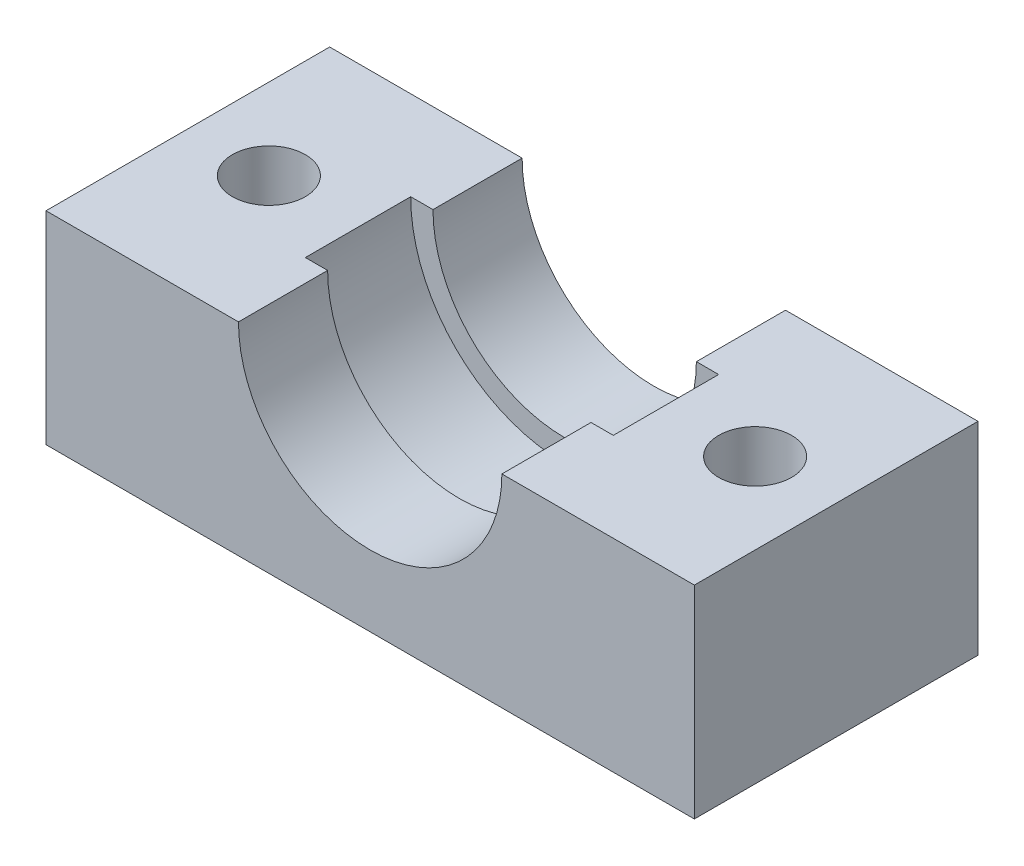
ISO-10303-21;
HEADER;
FILE_DESCRIPTION(('STEP AP214'),'2;1');
FILE_NAME('part.step','',(''),(''),'','','');
FILE_SCHEMA(('AUTOMOTIVE_DESIGN { 1 0 10303 214 1 1 1 1 }'));
ENDSEC;
DATA;
#1=APPLICATION_CONTEXT('core data for automotive mechanical design processes');
#2=APPLICATION_PROTOCOL_DEFINITION('international standard','automotive_design',2000,#1);
#3=PRODUCT_CONTEXT('',#1,'mechanical');
#4=PRODUCT('Part','Part','',(#3));
#5=PRODUCT_RELATED_PRODUCT_CATEGORY('part','',(#4));
#6=PRODUCT_DEFINITION_FORMATION('','',#4);
#7=PRODUCT_DEFINITION_CONTEXT('part definition',#1,'design');
#8=PRODUCT_DEFINITION('design','',#6,#7);
#9=PRODUCT_DEFINITION_SHAPE('','',#8);
#10=(LENGTH_UNIT() NAMED_UNIT(*) SI_UNIT(.MILLI.,.METRE.));
#11=(NAMED_UNIT(*) PLANE_ANGLE_UNIT() SI_UNIT($,.RADIAN.));
#12=(NAMED_UNIT(*) SI_UNIT($,.STERADIAN.) SOLID_ANGLE_UNIT());
#13=UNCERTAINTY_MEASURE_WITH_UNIT(LENGTH_MEASURE(1.E-05),#10,'distance_accuracy_value','');
#14=(GEOMETRIC_REPRESENTATION_CONTEXT(3) GLOBAL_UNCERTAINTY_ASSIGNED_CONTEXT((#13)) GLOBAL_UNIT_ASSIGNED_CONTEXT((#10,
#11,#12)) REPRESENTATION_CONTEXT('',''));
#15=CARTESIAN_POINT('',(0.,0.,0.));
#16=DIRECTION('',(0.,0.,1.));
#17=DIRECTION('',(1.,0.,0.));
#18=AXIS2_PLACEMENT_3D('',#15,#16,#17);
#19=CARTESIAN_POINT('',(0.,10.,0.));
#20=DIRECTION('',(0.,-1.,0.));
#21=DIRECTION('',(0.,0.,-1.));
#22=AXIS2_PLACEMENT_3D('',#19,#20,#21);
#23=PLANE('',#22);
#24=CARTESIAN_POINT('',(12.,10.,0.));
#25=DIRECTION('',(0.,-1.,0.));
#26=DIRECTION('',(0.,0.,-1.));
#27=AXIS2_PLACEMENT_3D('',#24,#25,#26);
#28=CIRCLE('',#27,1.8);
#29=CARTESIAN_POINT('',(12.,10.,-1.8));
#30=VERTEX_POINT('',#29);
#31=EDGE_CURVE('E208',#30,#30,#28,.T.);
#32=ORIENTED_EDGE('',*,*,#31,.T.);
#33=EDGE_LOOP('',(#32));
#34=FACE_BOUND('',#33,.T.);
#35=DIRECTION('',(-1.,0.,0.));
#36=VECTOR('',#35,1.);
#37=CARTESIAN_POINT('',(-16.,10.,-7.));
#38=LINE('',#37,#36);
#39=CARTESIAN_POINT('',(16.,10.,-7.));
#40=VERTEX_POINT('',#39);
#41=CARTESIAN_POINT('',(6.5,10.,-7.));
#42=VERTEX_POINT('',#41);
#43=EDGE_CURVE('E124',#40,#42,#38,.T.);
#44=ORIENTED_EDGE('',*,*,#43,.T.);
#45=DIRECTION('',(0.,0.,1.));
#46=VECTOR('',#45,1.);
#47=CARTESIAN_POINT('',(6.5,10.,-7.));
#48=LINE('',#47,#46);
#49=CARTESIAN_POINT('',(6.5,10.,-2.6));
#50=VERTEX_POINT('',#49);
#51=EDGE_CURVE('E109',#42,#50,#48,.T.);
#52=ORIENTED_EDGE('',*,*,#51,.T.);
#53=DIRECTION('',(-1.,0.,0.));
#54=VECTOR('',#53,1.);
#55=CARTESIAN_POINT('',(0.,10.,-2.6));
#56=LINE('',#55,#54);
#57=CARTESIAN_POINT('',(7.6,10.,-2.6));
#58=VERTEX_POINT('',#57);
#59=EDGE_CURVE('E43',#58,#50,#56,.T.);
#60=ORIENTED_EDGE('',*,*,#59,.F.);
#61=DIRECTION('',(0.,0.,1.));
#62=VECTOR('',#61,1.);
#63=CARTESIAN_POINT('',(7.6,10.,-2.6));
#64=LINE('',#63,#62);
#65=CARTESIAN_POINT('',(7.6,10.,2.6));
#66=VERTEX_POINT('',#65);
#67=EDGE_CURVE('E172',#58,#66,#64,.T.);
#68=ORIENTED_EDGE('',*,*,#67,.T.);
#69=DIRECTION('',(-1.,0.,0.));
#70=VECTOR('',#69,1.);
#71=CARTESIAN_POINT('',(0.,10.,2.6));
#72=LINE('',#71,#70);
#73=CARTESIAN_POINT('',(6.5,10.,2.6));
#74=VERTEX_POINT('',#73);
#75=EDGE_CURVE('E166',#66,#74,#72,.T.);
#76=ORIENTED_EDGE('',*,*,#75,.T.);
#77=CARTESIAN_POINT('',(6.5,10.,7.));
#78=VERTEX_POINT('',#77);
#79=EDGE_CURVE('E58',#74,#78,#48,.T.);
#80=ORIENTED_EDGE('',*,*,#79,.T.);
#81=DIRECTION('',(1.,0.,0.));
#82=VECTOR('',#81,1.);
#83=CARTESIAN_POINT('',(-16.,10.,7.));
#84=LINE('',#83,#82);
#85=CARTESIAN_POINT('',(16.,10.,7.));
#86=VERTEX_POINT('',#85);
#87=EDGE_CURVE('E136',#78,#86,#84,.T.);
#88=ORIENTED_EDGE('',*,*,#87,.T.);
#89=DIRECTION('',(0.,0.,-1.));
#90=VECTOR('',#89,1.);
#91=CARTESIAN_POINT('',(16.,10.,7.));
#92=LINE('',#91,#90);
#93=EDGE_CURVE('E132',#86,#40,#92,.T.);
#94=ORIENTED_EDGE('',*,*,#93,.T.);
#95=EDGE_LOOP('',(#44,#52,#60,#68,#76,#80,#88,#94));
#96=FACE_BOUND('',#95,.T.);
#97=ADVANCED_FACE('F35',(#34,#96),#23,.F.);
#98=CARTESIAN_POINT('',(-12.,10.,0.));
#99=DIRECTION('',(0.,-1.,0.));
#100=DIRECTION('',(0.,0.,-1.));
#101=AXIS2_PLACEMENT_3D('',#98,#99,#100);
#102=CIRCLE('',#101,1.8);
#103=CARTESIAN_POINT('',(-12.,10.,-1.8));
#104=VERTEX_POINT('',#103);
#105=EDGE_CURVE('E196',#104,#104,#102,.T.);
#106=ORIENTED_EDGE('',*,*,#105,.T.);
#107=EDGE_LOOP('',(#106));
#108=FACE_BOUND('',#107,.T.);
#109=CARTESIAN_POINT('',(-16.,10.,7.));
#110=VERTEX_POINT('',#109);
#111=CARTESIAN_POINT('',(-6.5,10.,7.));
#112=VERTEX_POINT('',#111);
#113=EDGE_CURVE('E141',#110,#112,#84,.T.);
#114=ORIENTED_EDGE('',*,*,#113,.T.);
#115=DIRECTION('',(0.,0.,1.));
#116=VECTOR('',#115,1.);
#117=CARTESIAN_POINT('',(-6.5,10.,-7.));
#118=LINE('',#117,#116);
#119=CARTESIAN_POINT('',(-6.5,10.,2.6));
#120=VERTEX_POINT('',#119);
#121=EDGE_CURVE('E128',#112,#120,#118,.F.);
#122=ORIENTED_EDGE('',*,*,#121,.T.);
#123=CARTESIAN_POINT('',(-7.6,10.,2.6));
#124=VERTEX_POINT('',#123);
#125=EDGE_CURVE('E165',#120,#124,#72,.T.);
#126=ORIENTED_EDGE('',*,*,#125,.T.);
#127=DIRECTION('',(0.,0.,1.));
#128=VECTOR('',#127,1.);
#129=CARTESIAN_POINT('',(-7.6,10.,-2.6));
#130=LINE('',#129,#128);
#131=CARTESIAN_POINT('',(-7.6,10.,-2.6));
#132=VERTEX_POINT('',#131);
#133=EDGE_CURVE('E169',#124,#132,#130,.F.);
#134=ORIENTED_EDGE('',*,*,#133,.T.);
#135=CARTESIAN_POINT('',(-6.5,10.,-2.6));
#136=VERTEX_POINT('',#135);
#137=EDGE_CURVE('E174',#136,#132,#56,.T.);
#138=ORIENTED_EDGE('',*,*,#137,.F.);
#139=CARTESIAN_POINT('',(-6.5,10.,-7.));
#140=VERTEX_POINT('',#139);
#141=EDGE_CURVE('E50',#136,#140,#118,.F.);
#142=ORIENTED_EDGE('',*,*,#141,.T.);
#143=CARTESIAN_POINT('',(-16.,10.,-7.));
#144=VERTEX_POINT('',#143);
#145=EDGE_CURVE('E127',#140,#144,#38,.T.);
#146=ORIENTED_EDGE('',*,*,#145,.T.);
#147=DIRECTION('',(0.,0.,1.));
#148=VECTOR('',#147,1.);
#149=CARTESIAN_POINT('',(-16.,10.,7.));
#150=LINE('',#149,#148);
#151=EDGE_CURVE('E134',#144,#110,#150,.T.);
#152=ORIENTED_EDGE('',*,*,#151,.T.);
#153=EDGE_LOOP('',(#114,#122,#126,#134,#138,#142,#146,#152));
#154=FACE_BOUND('',#153,.T.);
#155=ADVANCED_FACE('F186',(#108,#154),#23,.F.);
#156=CARTESIAN_POINT('',(16.,10.,7.));
#157=DIRECTION('',(-1.,0.,0.));
#158=DIRECTION('',(0.,0.,1.));
#159=AXIS2_PLACEMENT_3D('',#156,#157,#158);
#160=PLANE('',#159);
#161=DIRECTION('',(0.,0.,-1.));
#162=VECTOR('',#161,1.);
#163=CARTESIAN_POINT('',(16.,0.,7.));
#164=LINE('',#163,#162);
#165=CARTESIAN_POINT('',(16.,0.,7.));
#166=VERTEX_POINT('',#165);
#167=CARTESIAN_POINT('',(16.,0.,-7.));
#168=VERTEX_POINT('',#167);
#169=EDGE_CURVE('E145',#166,#168,#164,.T.);
#170=ORIENTED_EDGE('',*,*,#169,.T.);
#171=DIRECTION('',(0.,-1.,0.));
#172=VECTOR('',#171,1.);
#173=CARTESIAN_POINT('',(16.,10.,-7.));
#174=LINE('',#173,#172);
#175=EDGE_CURVE('E163',#40,#168,#174,.T.);
#176=ORIENTED_EDGE('',*,*,#175,.F.);
#177=ORIENTED_EDGE('',*,*,#93,.F.);
#178=DIRECTION('',(0.,-1.,0.));
#179=VECTOR('',#178,1.);
#180=CARTESIAN_POINT('',(16.,10.,7.));
#181=LINE('',#180,#179);
#182=EDGE_CURVE('E144',#86,#166,#181,.T.);
#183=ORIENTED_EDGE('',*,*,#182,.T.);
#184=EDGE_LOOP('',(#170,#176,#177,#183));
#185=FACE_BOUND('',#184,.T.);
#186=ADVANCED_FACE('F37',(#185),#160,.F.);
#187=CARTESIAN_POINT('',(-16.,10.,-7.));
#188=DIRECTION('',(0.,0.,1.));
#189=DIRECTION('',(1.,0.,0.));
#190=AXIS2_PLACEMENT_3D('',#187,#188,#189);
#191=PLANE('',#190);
#192=ORIENTED_EDGE('',*,*,#145,.F.);
#193=CARTESIAN_POINT('',(0.,10.,-7.));
#194=DIRECTION('',(0.,0.,1.));
#195=DIRECTION('',(1.,0.,0.));
#196=AXIS2_PLACEMENT_3D('',#193,#194,#195);
#197=CIRCLE('',#196,6.5);
#198=EDGE_CURVE('E112',#140,#42,#197,.T.);
#199=ORIENTED_EDGE('',*,*,#198,.T.);
#200=ORIENTED_EDGE('',*,*,#43,.F.);
#201=ORIENTED_EDGE('',*,*,#175,.T.);
#202=DIRECTION('',(-1.,0.,0.));
#203=VECTOR('',#202,1.);
#204=CARTESIAN_POINT('',(-16.,0.,-7.));
#205=LINE('',#204,#203);
#206=CARTESIAN_POINT('',(-16.,0.,-7.));
#207=VERTEX_POINT('',#206);
#208=EDGE_CURVE('E148',#168,#207,#205,.T.);
#209=ORIENTED_EDGE('',*,*,#208,.T.);
#210=DIRECTION('',(0.,-1.,0.));
#211=VECTOR('',#210,1.);
#212=CARTESIAN_POINT('',(-16.,10.,-7.));
#213=LINE('',#212,#211);
#214=EDGE_CURVE('E160',#144,#207,#213,.T.);
#215=ORIENTED_EDGE('',*,*,#214,.F.);
#216=EDGE_LOOP('',(#192,#199,#200,#201,#209,#215));
#217=FACE_BOUND('',#216,.T.);
#218=ADVANCED_FACE('F122',(#217),#191,.F.);
#219=CARTESIAN_POINT('',(-16.,10.,7.));
#220=DIRECTION('',(1.,0.,0.));
#221=DIRECTION('',(0.,0.,-1.));
#222=AXIS2_PLACEMENT_3D('',#219,#220,#221);
#223=PLANE('',#222);
#224=DIRECTION('',(0.,0.,1.));
#225=VECTOR('',#224,1.);
#226=CARTESIAN_POINT('',(-16.,0.,7.));
#227=LINE('',#226,#225);
#228=CARTESIAN_POINT('',(-16.,0.,7.));
#229=VERTEX_POINT('',#228);
#230=EDGE_CURVE('E151',#207,#229,#227,.T.);
#231=ORIENTED_EDGE('',*,*,#230,.T.);
#232=DIRECTION('',(0.,-1.,0.));
#233=VECTOR('',#232,1.);
#234=CARTESIAN_POINT('',(-16.,10.,7.));
#235=LINE('',#234,#233);
#236=EDGE_CURVE('E157',#110,#229,#235,.T.);
#237=ORIENTED_EDGE('',*,*,#236,.F.);
#238=ORIENTED_EDGE('',*,*,#151,.F.);
#239=ORIENTED_EDGE('',*,*,#214,.T.);
#240=EDGE_LOOP('',(#231,#237,#238,#239));
#241=FACE_BOUND('',#240,.T.);
#242=ADVANCED_FACE('F242',(#241),#223,.F.);
#243=CARTESIAN_POINT('',(-16.,10.,7.));
#244=DIRECTION('',(0.,0.,-1.));
#245=DIRECTION('',(-1.,0.,0.));
#246=AXIS2_PLACEMENT_3D('',#243,#244,#245);
#247=PLANE('',#246);
#248=ORIENTED_EDGE('',*,*,#87,.F.);
#249=CARTESIAN_POINT('',(0.,10.,7.));
#250=DIRECTION('',(0.,0.,1.));
#251=DIRECTION('',(1.,0.,0.));
#252=AXIS2_PLACEMENT_3D('',#249,#250,#251);
#253=CIRCLE('',#252,6.5);
#254=EDGE_CURVE('E129',#112,#78,#253,.T.);
#255=ORIENTED_EDGE('',*,*,#254,.F.);
#256=ORIENTED_EDGE('',*,*,#113,.F.);
#257=ORIENTED_EDGE('',*,*,#236,.T.);
#258=DIRECTION('',(1.,0.,0.));
#259=VECTOR('',#258,1.);
#260=CARTESIAN_POINT('',(-16.,0.,7.));
#261=LINE('',#260,#259);
#262=EDGE_CURVE('E153',#229,#166,#261,.T.);
#263=ORIENTED_EDGE('',*,*,#262,.T.);
#264=ORIENTED_EDGE('',*,*,#182,.F.);
#265=EDGE_LOOP('',(#248,#255,#256,#257,#263,#264));
#266=FACE_BOUND('',#265,.T.);
#267=ADVANCED_FACE('F226',(#266),#247,.F.);
#268=CARTESIAN_POINT('',(0.,0.,0.));
#269=DIRECTION('',(0.,-1.,0.));
#270=DIRECTION('',(0.,0.,-1.));
#271=AXIS2_PLACEMENT_3D('',#268,#269,#270);
#272=PLANE('',#271);
#273=CARTESIAN_POINT('',(12.,0.,0.));
#274=DIRECTION('',(0.,-1.,0.));
#275=DIRECTION('',(0.,0.,-1.));
#276=AXIS2_PLACEMENT_3D('',#273,#274,#275);
#277=CIRCLE('',#276,3.25);
#278=CARTESIAN_POINT('',(12.,0.,-3.25));
#279=VERTEX_POINT('',#278);
#280=EDGE_CURVE('E217',#279,#279,#277,.T.);
#281=ORIENTED_EDGE('',*,*,#280,.F.);
#282=EDGE_LOOP('',(#281));
#283=FACE_BOUND('',#282,.T.);
#284=CARTESIAN_POINT('',(-12.,0.,0.));
#285=DIRECTION('',(0.,-1.,0.));
#286=DIRECTION('',(0.,0.,-1.));
#287=AXIS2_PLACEMENT_3D('',#284,#285,#286);
#288=CIRCLE('',#287,3.25);
#289=CARTESIAN_POINT('',(-12.,0.,-3.25));
#290=VERTEX_POINT('',#289);
#291=EDGE_CURVE('E205',#290,#290,#288,.T.);
#292=ORIENTED_EDGE('',*,*,#291,.F.);
#293=EDGE_LOOP('',(#292));
#294=FACE_BOUND('',#293,.T.);
#295=ORIENTED_EDGE('',*,*,#169,.F.);
#296=ORIENTED_EDGE('',*,*,#262,.F.);
#297=ORIENTED_EDGE('',*,*,#230,.F.);
#298=ORIENTED_EDGE('',*,*,#208,.F.);
#299=EDGE_LOOP('',(#295,#296,#297,#298));
#300=FACE_BOUND('',#299,.T.);
#301=ADVANCED_FACE('F223',(#283,#294,#300),#272,.T.);
#302=CARTESIAN_POINT('',(0.,10.,-2.6));
#303=DIRECTION('',(0.,0.,1.));
#304=DIRECTION('',(1.,0.,0.));
#305=AXIS2_PLACEMENT_3D('',#302,#303,#304);
#306=CYLINDRICAL_SURFACE('',#305,7.6);
#307=CARTESIAN_POINT('',(0.,10.,-2.6));
#308=DIRECTION('',(0.,0.,1.));
#309=DIRECTION('',(1.,0.,0.));
#310=AXIS2_PLACEMENT_3D('',#307,#308,#309);
#311=CIRCLE('',#310,7.6);
#312=EDGE_CURVE('E149',#132,#58,#311,.T.);
#313=ORIENTED_EDGE('',*,*,#312,.F.);
#314=ORIENTED_EDGE('',*,*,#133,.F.);
#315=CARTESIAN_POINT('',(0.,10.,2.6));
#316=DIRECTION('',(0.,0.,1.));
#317=DIRECTION('',(1.,0.,0.));
#318=AXIS2_PLACEMENT_3D('',#315,#316,#317);
#319=CIRCLE('',#318,7.6);
#320=EDGE_CURVE('E118',#124,#66,#319,.T.);
#321=ORIENTED_EDGE('',*,*,#320,.T.);
#322=ORIENTED_EDGE('',*,*,#67,.F.);
#323=EDGE_LOOP('',(#313,#314,#321,#322));
#324=FACE_BOUND('',#323,.T.);
#325=ADVANCED_FACE('F183',(#324),#306,.F.);
#326=CARTESIAN_POINT('',(0.,10.,-2.6));
#327=DIRECTION('',(0.,0.,1.));
#328=DIRECTION('',(1.,0.,0.));
#329=AXIS2_PLACEMENT_3D('',#326,#327,#328);
#330=PLANE('',#329);
#331=CARTESIAN_POINT('',(0.,10.,-2.6));
#332=DIRECTION('',(0.,0.,1.));
#333=DIRECTION('',(1.,0.,0.));
#334=AXIS2_PLACEMENT_3D('',#331,#332,#333);
#335=CIRCLE('',#334,6.5);
#336=EDGE_CURVE('E113',#136,#50,#335,.T.);
#337=ORIENTED_EDGE('',*,*,#336,.F.);
#338=ORIENTED_EDGE('',*,*,#137,.T.);
#339=ORIENTED_EDGE('',*,*,#312,.T.);
#340=ORIENTED_EDGE('',*,*,#59,.T.);
#341=EDGE_LOOP('',(#337,#338,#339,#340));
#342=FACE_BOUND('',#341,.T.);
#343=ADVANCED_FACE('F179',(#342),#330,.T.);
#344=CARTESIAN_POINT('',(0.,10.,2.6));
#345=DIRECTION('',(0.,0.,1.));
#346=DIRECTION('',(1.,0.,0.));
#347=AXIS2_PLACEMENT_3D('',#344,#345,#346);
#348=PLANE('',#347);
#349=ORIENTED_EDGE('',*,*,#125,.F.);
#350=CARTESIAN_POINT('',(0.,10.,2.6));
#351=DIRECTION('',(0.,0.,1.));
#352=DIRECTION('',(1.,0.,0.));
#353=AXIS2_PLACEMENT_3D('',#350,#351,#352);
#354=CIRCLE('',#353,6.5);
#355=EDGE_CURVE('E11',#120,#74,#354,.T.);
#356=ORIENTED_EDGE('',*,*,#355,.T.);
#357=ORIENTED_EDGE('',*,*,#75,.F.);
#358=ORIENTED_EDGE('',*,*,#320,.F.);
#359=EDGE_LOOP('',(#349,#356,#357,#358));
#360=FACE_BOUND('',#359,.T.);
#361=ADVANCED_FACE('F191',(#360),#348,.F.);
#362=CARTESIAN_POINT('',(0.,10.,-7.));
#363=DIRECTION('',(0.,0.,1.));
#364=DIRECTION('',(1.,0.,0.));
#365=AXIS2_PLACEMENT_3D('',#362,#363,#364);
#366=CYLINDRICAL_SURFACE('',#365,6.5);
#367=ORIENTED_EDGE('',*,*,#355,.F.);
#368=ORIENTED_EDGE('',*,*,#121,.F.);
#369=ORIENTED_EDGE('',*,*,#254,.T.);
#370=ORIENTED_EDGE('',*,*,#79,.F.);
#371=EDGE_LOOP('',(#367,#368,#369,#370));
#372=FACE_BOUND('',#371,.T.);
#373=ADVANCED_FACE('F262',(#372),#366,.F.);
#374=ORIENTED_EDGE('',*,*,#198,.F.);
#375=ORIENTED_EDGE('',*,*,#141,.F.);
#376=ORIENTED_EDGE('',*,*,#336,.T.);
#377=ORIENTED_EDGE('',*,*,#51,.F.);
#378=EDGE_LOOP('',(#374,#375,#376,#377));
#379=FACE_BOUND('',#378,.T.);
#380=ADVANCED_FACE('F111',(#379),#366,.F.);
#381=CARTESIAN_POINT('',(-12.,0.,0.));
#382=DIRECTION('',(0.,-1.,0.));
#383=DIRECTION('',(0.,0.,-1.));
#384=AXIS2_PLACEMENT_3D('',#381,#382,#383);
#385=CYLINDRICAL_SURFACE('',#384,1.8);
#386=ORIENTED_EDGE('',*,*,#105,.F.);
#387=EDGE_LOOP('',(#386));
#388=FACE_BOUND('',#387,.T.);
#389=CARTESIAN_POINT('',(-12.,3.4,0.));
#390=DIRECTION('',(0.,-1.,0.));
#391=DIRECTION('',(0.,0.,-1.));
#392=AXIS2_PLACEMENT_3D('',#389,#390,#391);
#393=CIRCLE('',#392,1.8);
#394=CARTESIAN_POINT('',(-12.,3.4,-1.8));
#395=VERTEX_POINT('',#394);
#396=EDGE_CURVE('E199',#395,#395,#393,.T.);
#397=ORIENTED_EDGE('',*,*,#396,.T.);
#398=EDGE_LOOP('',(#397));
#399=FACE_BOUND('',#398,.T.);
#400=ADVANCED_FACE('F267',(#388,#399),#385,.F.);
#401=CARTESIAN_POINT('',(-10.2,3.4,0.));
#402=DIRECTION('',(0.,1.,0.));
#403=DIRECTION('',(0.,0.,1.));
#404=AXIS2_PLACEMENT_3D('',#401,#402,#403);
#405=PLANE('',#404);
#406=ORIENTED_EDGE('',*,*,#396,.F.);
#407=EDGE_LOOP('',(#406));
#408=FACE_BOUND('',#407,.T.);
#409=CARTESIAN_POINT('',(-12.,3.4,0.));
#410=DIRECTION('',(0.,-1.,0.));
#411=DIRECTION('',(0.,0.,-1.));
#412=AXIS2_PLACEMENT_3D('',#409,#410,#411);
#413=CIRCLE('',#412,3.25);
#414=CARTESIAN_POINT('',(-12.,3.4,-3.25));
#415=VERTEX_POINT('',#414);
#416=EDGE_CURVE('E202',#415,#415,#413,.T.);
#417=ORIENTED_EDGE('',*,*,#416,.T.);
#418=EDGE_LOOP('',(#417));
#419=FACE_BOUND('',#418,.T.);
#420=ADVANCED_FACE('F270',(#408,#419),#405,.F.);
#421=CARTESIAN_POINT('',(-12.,0.,0.));
#422=DIRECTION('',(0.,-1.,0.));
#423=DIRECTION('',(0.,0.,-1.));
#424=AXIS2_PLACEMENT_3D('',#421,#422,#423);
#425=CYLINDRICAL_SURFACE('',#424,3.25);
#426=ORIENTED_EDGE('',*,*,#416,.F.);
#427=EDGE_LOOP('',(#426));
#428=FACE_BOUND('',#427,.T.);
#429=ORIENTED_EDGE('',*,*,#291,.T.);
#430=EDGE_LOOP('',(#429));
#431=FACE_BOUND('',#430,.T.);
#432=ADVANCED_FACE('F274',(#428,#431),#425,.F.);
#433=CARTESIAN_POINT('',(12.,0.,0.));
#434=DIRECTION('',(0.,-1.,0.));
#435=DIRECTION('',(0.,0.,-1.));
#436=AXIS2_PLACEMENT_3D('',#433,#434,#435);
#437=CYLINDRICAL_SURFACE('',#436,1.8);
#438=ORIENTED_EDGE('',*,*,#31,.F.);
#439=EDGE_LOOP('',(#438));
#440=FACE_BOUND('',#439,.T.);
#441=CARTESIAN_POINT('',(12.,3.4,0.));
#442=DIRECTION('',(0.,-1.,0.));
#443=DIRECTION('',(0.,0.,-1.));
#444=AXIS2_PLACEMENT_3D('',#441,#442,#443);
#445=CIRCLE('',#444,1.8);
#446=CARTESIAN_POINT('',(12.,3.4,-1.8));
#447=VERTEX_POINT('',#446);
#448=EDGE_CURVE('E211',#447,#447,#445,.T.);
#449=ORIENTED_EDGE('',*,*,#448,.T.);
#450=EDGE_LOOP('',(#449));
#451=FACE_BOUND('',#450,.T.);
#452=ADVANCED_FACE('F278',(#440,#451),#437,.F.);
#453=CARTESIAN_POINT('',(13.8,3.4,0.));
#454=DIRECTION('',(0.,1.,0.));
#455=DIRECTION('',(0.,0.,1.));
#456=AXIS2_PLACEMENT_3D('',#453,#454,#455);
#457=PLANE('',#456);
#458=ORIENTED_EDGE('',*,*,#448,.F.);
#459=EDGE_LOOP('',(#458));
#460=FACE_BOUND('',#459,.T.);
#461=CARTESIAN_POINT('',(12.,3.4,0.));
#462=DIRECTION('',(0.,-1.,0.));
#463=DIRECTION('',(0.,0.,-1.));
#464=AXIS2_PLACEMENT_3D('',#461,#462,#463);
#465=CIRCLE('',#464,3.25);
#466=CARTESIAN_POINT('',(12.,3.4,-3.25));
#467=VERTEX_POINT('',#466);
#468=EDGE_CURVE('E214',#467,#467,#465,.T.);
#469=ORIENTED_EDGE('',*,*,#468,.T.);
#470=EDGE_LOOP('',(#469));
#471=FACE_BOUND('',#470,.T.);
#472=ADVANCED_FACE('F282',(#460,#471),#457,.F.);
#473=CARTESIAN_POINT('',(12.,0.,0.));
#474=DIRECTION('',(0.,-1.,0.));
#475=DIRECTION('',(0.,0.,-1.));
#476=AXIS2_PLACEMENT_3D('',#473,#474,#475);
#477=CYLINDRICAL_SURFACE('',#476,3.25);
#478=ORIENTED_EDGE('',*,*,#468,.F.);
#479=EDGE_LOOP('',(#478));
#480=FACE_BOUND('',#479,.T.);
#481=ORIENTED_EDGE('',*,*,#280,.T.);
#482=EDGE_LOOP('',(#481));
#483=FACE_BOUND('',#482,.T.);
#484=ADVANCED_FACE('F221',(#480,#483),#477,.F.);
#485=CLOSED_SHELL('',(#97,#155,#186,#218,#242,#267,#301,#325,#343,#361,#373,#380,#400,#420,#432,
#452,#472,#484));
#486=MANIFOLD_SOLID_BREP('B2',#485);
#487=ADVANCED_BREP_SHAPE_REPRESENTATION('',(#18,#486),#14);
#488=SHAPE_DEFINITION_REPRESENTATION(#9,#487);
ENDSEC;
END-ISO-10303-21;
